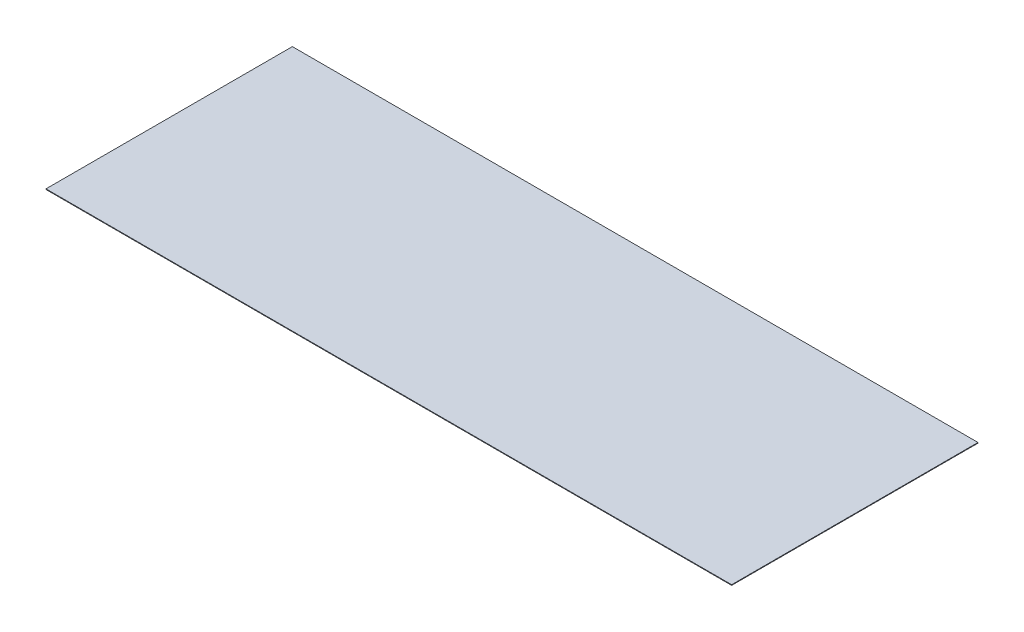
ISO-10303-21;
HEADER;
FILE_DESCRIPTION(('STEP AP214'),'2;1');
FILE_NAME('part.step','',(''),(''),'','','');
FILE_SCHEMA(('AUTOMOTIVE_DESIGN { 1 0 10303 214 1 1 1 1 }'));
ENDSEC;
DATA;
#1=APPLICATION_CONTEXT('core data for automotive mechanical design processes');
#2=APPLICATION_PROTOCOL_DEFINITION('international standard','automotive_design',2000,#1);
#3=PRODUCT_CONTEXT('',#1,'mechanical');
#4=PRODUCT('Part','Part','',(#3));
#5=PRODUCT_RELATED_PRODUCT_CATEGORY('part','',(#4));
#6=PRODUCT_DEFINITION_FORMATION('','',#4);
#7=PRODUCT_DEFINITION_CONTEXT('part definition',#1,'design');
#8=PRODUCT_DEFINITION('design','',#6,#7);
#9=PRODUCT_DEFINITION_SHAPE('','',#8);
#10=(LENGTH_UNIT() NAMED_UNIT(*) SI_UNIT(.MILLI.,.METRE.));
#11=(NAMED_UNIT(*) PLANE_ANGLE_UNIT() SI_UNIT($,.RADIAN.));
#12=(NAMED_UNIT(*) SI_UNIT($,.STERADIAN.) SOLID_ANGLE_UNIT());
#13=UNCERTAINTY_MEASURE_WITH_UNIT(LENGTH_MEASURE(1.E-05),#10,'distance_accuracy_value','');
#14=(GEOMETRIC_REPRESENTATION_CONTEXT(3) GLOBAL_UNCERTAINTY_ASSIGNED_CONTEXT((#13)) GLOBAL_UNIT_ASSIGNED_CONTEXT((#10,
#11,#12)) REPRESENTATION_CONTEXT('',''));
#15=CARTESIAN_POINT('',(0.,0.,0.));
#16=DIRECTION('',(0.,0.,1.));
#17=DIRECTION('',(1.,0.,0.));
#18=AXIS2_PLACEMENT_3D('',#15,#16,#17);
#19=CARTESIAN_POINT('',(-56.5,0.1,20.3));
#20=DIRECTION('',(1.,0.,0.));
#21=DIRECTION('',(0.,0.,-1.));
#22=AXIS2_PLACEMENT_3D('',#19,#20,#21);
#23=PLANE('',#22);
#24=DIRECTION('',(0.,0.,1.));
#25=VECTOR('',#24,1.);
#26=CARTESIAN_POINT('',(-56.5,0.,20.3));
#27=LINE('',#26,#25);
#28=CARTESIAN_POINT('',(-56.5,0.,-20.3));
#29=VERTEX_POINT('',#28);
#30=CARTESIAN_POINT('',(-56.5,0.,20.3));
#31=VERTEX_POINT('',#30);
#32=EDGE_CURVE('E95',#29,#31,#27,.T.);
#33=ORIENTED_EDGE('',*,*,#32,.T.);
#34=DIRECTION('',(0.,-1.,0.));
#35=VECTOR('',#34,1.);
#36=CARTESIAN_POINT('',(-56.5,0.1,20.3));
#37=LINE('',#36,#35);
#38=CARTESIAN_POINT('',(-56.5,0.1,20.3));
#39=VERTEX_POINT('',#38);
#40=EDGE_CURVE('E11',#39,#31,#37,.T.);
#41=ORIENTED_EDGE('',*,*,#40,.F.);
#42=DIRECTION('',(0.,0.,1.));
#43=VECTOR('',#42,1.);
#44=CARTESIAN_POINT('',(-56.5,0.1,20.3));
#45=LINE('',#44,#43);
#46=CARTESIAN_POINT('',(-56.5,0.1,-20.3));
#47=VERTEX_POINT('',#46);
#48=EDGE_CURVE('E83',#47,#39,#45,.T.);
#49=ORIENTED_EDGE('',*,*,#48,.F.);
#50=DIRECTION('',(0.,-1.,0.));
#51=VECTOR('',#50,1.);
#52=CARTESIAN_POINT('',(-56.5,0.1,-20.3));
#53=LINE('',#52,#51);
#54=EDGE_CURVE('E91',#47,#29,#53,.T.);
#55=ORIENTED_EDGE('',*,*,#54,.T.);
#56=EDGE_LOOP('',(#33,#41,#49,#55));
#57=FACE_BOUND('',#56,.T.);
#58=ADVANCED_FACE('F32',(#57),#23,.F.);
#59=CARTESIAN_POINT('',(56.5,0.1,20.3));
#60=DIRECTION('',(0.,0.,-1.));
#61=DIRECTION('',(-1.,0.,0.));
#62=AXIS2_PLACEMENT_3D('',#59,#60,#61);
#63=PLANE('',#62);
#64=DIRECTION('',(1.,0.,0.));
#65=VECTOR('',#64,1.);
#66=CARTESIAN_POINT('',(56.5,0.,20.3));
#67=LINE('',#66,#65);
#68=CARTESIAN_POINT('',(56.5,0.,20.3));
#69=VERTEX_POINT('',#68);
#70=EDGE_CURVE('E87',#31,#69,#67,.T.);
#71=ORIENTED_EDGE('',*,*,#70,.T.);
#72=DIRECTION('',(0.,-1.,0.));
#73=VECTOR('',#72,1.);
#74=CARTESIAN_POINT('',(56.5,0.1,20.3));
#75=LINE('',#74,#73);
#76=CARTESIAN_POINT('',(56.5,0.1,20.3));
#77=VERTEX_POINT('',#76);
#78=EDGE_CURVE('E40',#77,#69,#75,.T.);
#79=ORIENTED_EDGE('',*,*,#78,.F.);
#80=DIRECTION('',(1.,0.,0.));
#81=VECTOR('',#80,1.);
#82=CARTESIAN_POINT('',(56.5,0.1,20.3));
#83=LINE('',#82,#81);
#84=EDGE_CURVE('E78',#39,#77,#83,.T.);
#85=ORIENTED_EDGE('',*,*,#84,.F.);
#86=ORIENTED_EDGE('',*,*,#40,.T.);
#87=EDGE_LOOP('',(#71,#79,#85,#86));
#88=FACE_BOUND('',#87,.T.);
#89=ADVANCED_FACE('F86',(#88),#63,.F.);
#90=CARTESIAN_POINT('',(56.5,0.1,20.3));
#91=DIRECTION('',(-1.,0.,0.));
#92=DIRECTION('',(0.,0.,1.));
#93=AXIS2_PLACEMENT_3D('',#90,#91,#92);
#94=PLANE('',#93);
#95=DIRECTION('',(0.,0.,-1.));
#96=VECTOR('',#95,1.);
#97=CARTESIAN_POINT('',(56.5,0.,20.3));
#98=LINE('',#97,#96);
#99=CARTESIAN_POINT('',(56.5,0.,-20.3));
#100=VERTEX_POINT('',#99);
#101=EDGE_CURVE('E65',#69,#100,#98,.T.);
#102=ORIENTED_EDGE('',*,*,#101,.T.);
#103=DIRECTION('',(0.,-1.,0.));
#104=VECTOR('',#103,1.);
#105=CARTESIAN_POINT('',(56.5,0.1,-20.3));
#106=LINE('',#105,#104);
#107=CARTESIAN_POINT('',(56.5,0.1,-20.3));
#108=VERTEX_POINT('',#107);
#109=EDGE_CURVE('E88',#108,#100,#106,.T.);
#110=ORIENTED_EDGE('',*,*,#109,.F.);
#111=DIRECTION('',(0.,0.,-1.));
#112=VECTOR('',#111,1.);
#113=CARTESIAN_POINT('',(56.5,0.1,20.3));
#114=LINE('',#113,#112);
#115=EDGE_CURVE('E81',#77,#108,#114,.T.);
#116=ORIENTED_EDGE('',*,*,#115,.F.);
#117=ORIENTED_EDGE('',*,*,#78,.T.);
#118=EDGE_LOOP('',(#102,#110,#116,#117));
#119=FACE_BOUND('',#118,.T.);
#120=ADVANCED_FACE('F89',(#119),#94,.F.);
#121=CARTESIAN_POINT('',(56.5,0.1,-20.3));
#122=DIRECTION('',(0.,0.,1.));
#123=DIRECTION('',(1.,0.,0.));
#124=AXIS2_PLACEMENT_3D('',#121,#122,#123);
#125=PLANE('',#124);
#126=DIRECTION('',(-1.,0.,0.));
#127=VECTOR('',#126,1.);
#128=CARTESIAN_POINT('',(56.5,0.,-20.3));
#129=LINE('',#128,#127);
#130=EDGE_CURVE('E71',#100,#29,#129,.T.);
#131=ORIENTED_EDGE('',*,*,#130,.T.);
#132=ORIENTED_EDGE('',*,*,#54,.F.);
#133=DIRECTION('',(-1.,0.,0.));
#134=VECTOR('',#133,1.);
#135=CARTESIAN_POINT('',(56.5,0.1,-20.3));
#136=LINE('',#135,#134);
#137=EDGE_CURVE('E48',#108,#47,#136,.T.);
#138=ORIENTED_EDGE('',*,*,#137,.F.);
#139=ORIENTED_EDGE('',*,*,#109,.T.);
#140=EDGE_LOOP('',(#131,#132,#138,#139));
#141=FACE_BOUND('',#140,.T.);
#142=ADVANCED_FACE('F102',(#141),#125,.F.);
#143=CARTESIAN_POINT('',(0.,0.1,0.));
#144=DIRECTION('',(0.,1.,0.));
#145=DIRECTION('',(0.,0.,1.));
#146=AXIS2_PLACEMENT_3D('',#143,#144,#145);
#147=PLANE('',#146);
#148=ORIENTED_EDGE('',*,*,#48,.T.);
#149=ORIENTED_EDGE('',*,*,#84,.T.);
#150=ORIENTED_EDGE('',*,*,#115,.T.);
#151=ORIENTED_EDGE('',*,*,#137,.T.);
#152=EDGE_LOOP('',(#148,#149,#150,#151));
#153=FACE_BOUND('',#152,.T.);
#154=ADVANCED_FACE('F79',(#153),#147,.T.);
#155=CARTESIAN_POINT('',(0.,0.,0.));
#156=DIRECTION('',(0.,1.,0.));
#157=DIRECTION('',(0.,0.,1.));
#158=AXIS2_PLACEMENT_3D('',#155,#156,#157);
#159=PLANE('',#158);
#160=ORIENTED_EDGE('',*,*,#32,.F.);
#161=ORIENTED_EDGE('',*,*,#130,.F.);
#162=ORIENTED_EDGE('',*,*,#101,.F.);
#163=ORIENTED_EDGE('',*,*,#70,.F.);
#164=EDGE_LOOP('',(#160,#161,#162,#163));
#165=FACE_BOUND('',#164,.T.);
#166=ADVANCED_FACE('F105',(#165),#159,.F.);
#167=CLOSED_SHELL('',(#58,#89,#120,#142,#154,#166));
#168=MANIFOLD_SOLID_BREP('B2',#167);
#169=ADVANCED_BREP_SHAPE_REPRESENTATION('',(#18,#168),#14);
#170=SHAPE_DEFINITION_REPRESENTATION(#9,#169);
ENDSEC;
END-ISO-10303-21;
